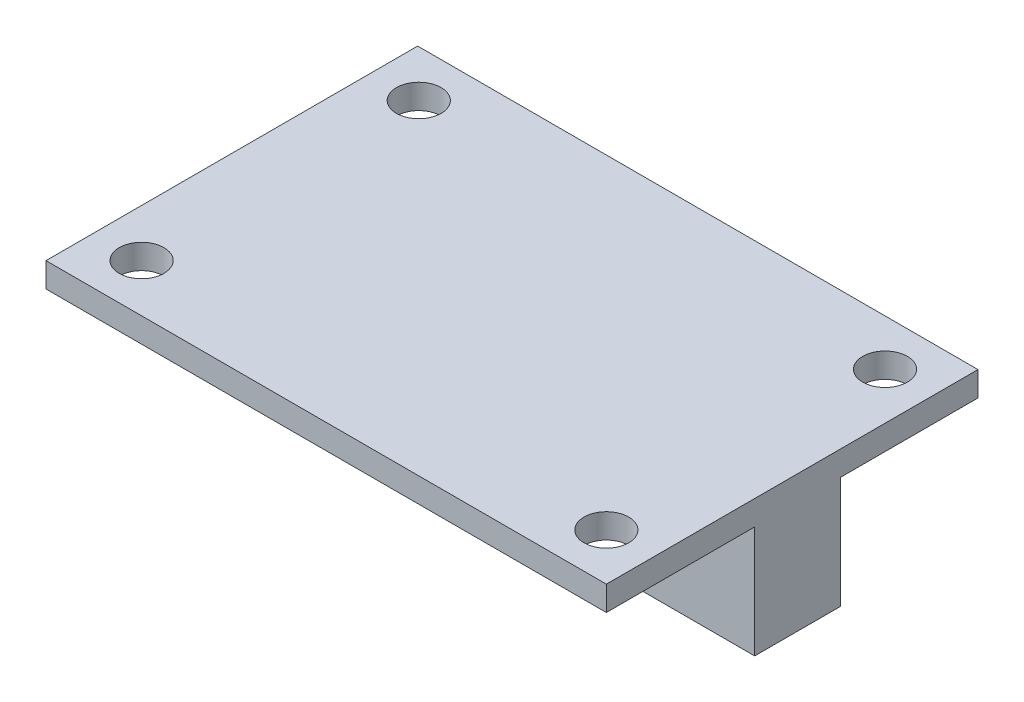
ISO-10303-21;
HEADER;
FILE_DESCRIPTION(('STEP AP214'),'2;1');
FILE_NAME('part.step','',(''),(''),'','','');
FILE_SCHEMA(('AUTOMOTIVE_DESIGN { 1 0 10303 214 1 1 1 1 }'));
ENDSEC;
DATA;
#1=APPLICATION_CONTEXT('core data for automotive mechanical design processes');
#2=APPLICATION_PROTOCOL_DEFINITION('international standard','automotive_design',2000,#1);
#3=PRODUCT_CONTEXT('',#1,'mechanical');
#4=PRODUCT('Part','Part','',(#3));
#5=PRODUCT_RELATED_PRODUCT_CATEGORY('part','',(#4));
#6=PRODUCT_DEFINITION_FORMATION('','',#4);
#7=PRODUCT_DEFINITION_CONTEXT('part definition',#1,'design');
#8=PRODUCT_DEFINITION('design','',#6,#7);
#9=PRODUCT_DEFINITION_SHAPE('','',#8);
#10=(LENGTH_UNIT() NAMED_UNIT(*) SI_UNIT(.MILLI.,.METRE.));
#11=(NAMED_UNIT(*) PLANE_ANGLE_UNIT() SI_UNIT($,.RADIAN.));
#12=(NAMED_UNIT(*) SI_UNIT($,.STERADIAN.) SOLID_ANGLE_UNIT());
#13=UNCERTAINTY_MEASURE_WITH_UNIT(LENGTH_MEASURE(1.E-05),#10,'distance_accuracy_value','');
#14=(GEOMETRIC_REPRESENTATION_CONTEXT(3) GLOBAL_UNCERTAINTY_ASSIGNED_CONTEXT((#13)) GLOBAL_UNIT_ASSIGNED_CONTEXT((#10,
#11,#12)) REPRESENTATION_CONTEXT('',''));
#15=CARTESIAN_POINT('',(0.,0.,0.));
#16=DIRECTION('',(0.,0.,1.));
#17=DIRECTION('',(1.,0.,0.));
#18=AXIS2_PLACEMENT_3D('',#15,#16,#17);
#19=CARTESIAN_POINT('',(0.,0.,0.));
#20=DIRECTION('',(0.,1.,0.));
#21=DIRECTION('',(0.,0.,1.));
#22=AXIS2_PLACEMENT_3D('',#19,#20,#21);
#23=PLANE('',#22);
#24=CARTESIAN_POINT('',(-15.8492761470884,0.,-9.49368315878314));
#25=DIRECTION('',(0.,1.,0.));
#26=DIRECTION('',(0.,0.,1.));
#27=AXIS2_PLACEMENT_3D('',#24,#25,#26);
#28=CIRCLE('',#27,1.524);
#29=CARTESIAN_POINT('',(-15.8492761470884,0.,-7.96968315878314));
#30=VERTEX_POINT('',#29);
#31=EDGE_CURVE('E146',#30,#30,#28,.T.);
#32=ORIENTED_EDGE('',*,*,#31,.T.);
#33=EDGE_LOOP('',(#32));
#34=FACE_BOUND('',#33,.T.);
#35=CARTESIAN_POINT('',(-15.8492761470884,0.,9.40478315878314));
#36=DIRECTION('',(0.,1.,0.));
#37=DIRECTION('',(0.,0.,1.));
#38=AXIS2_PLACEMENT_3D('',#35,#36,#37);
#39=CIRCLE('',#38,1.524);
#40=CARTESIAN_POINT('',(-15.8492761470884,0.,10.9287831587831));
#41=VERTEX_POINT('',#40);
#42=EDGE_CURVE('E135',#41,#41,#39,.T.);
#43=ORIENTED_EDGE('',*,*,#42,.T.);
#44=EDGE_LOOP('',(#43));
#45=FACE_BOUND('',#44,.T.);
#46=CARTESIAN_POINT('',(15.9000761470884,0.,9.46828315878314));
#47=DIRECTION('',(0.,1.,0.));
#48=DIRECTION('',(0.,0.,1.));
#49=AXIS2_PLACEMENT_3D('',#46,#47,#48);
#50=CIRCLE('',#49,1.524);
#51=CARTESIAN_POINT('',(15.9000761470884,0.,10.9922831587831));
#52=VERTEX_POINT('',#51);
#53=EDGE_CURVE('E141',#52,#52,#50,.T.);
#54=ORIENTED_EDGE('',*,*,#53,.T.);
#55=EDGE_LOOP('',(#54));
#56=FACE_BOUND('',#55,.T.);
#57=CARTESIAN_POINT('',(15.9127761470884,0.,-9.51908315878314));
#58=DIRECTION('',(0.,1.,0.));
#59=DIRECTION('',(0.,0.,1.));
#60=AXIS2_PLACEMENT_3D('',#57,#58,#59);
#61=CIRCLE('',#60,1.524);
#62=CARTESIAN_POINT('',(15.9127761470884,0.,-7.99508315878314));
#63=VERTEX_POINT('',#62);
#64=EDGE_CURVE('E122',#63,#63,#61,.T.);
#65=ORIENTED_EDGE('',*,*,#64,.T.);
#66=EDGE_LOOP('',(#65));
#67=FACE_BOUND('',#66,.T.);
#68=DIRECTION('',(1.,0.,0.));
#69=VECTOR('',#68,1.);
#70=CARTESIAN_POINT('',(19.1004761470884,0.,-3.28611234979803));
#71=LINE('',#70,#69);
#72=CARTESIAN_POINT('',(11.3391371140317,0.,-3.28611234979803));
#73=VERTEX_POINT('',#72);
#74=CARTESIAN_POINT('',(19.1004761470884,0.,-3.28611234979803));
#75=VERTEX_POINT('',#74);
#76=EDGE_CURVE('E49',#73,#75,#71,.T.);
#77=ORIENTED_EDGE('',*,*,#76,.F.);
#78=DIRECTION('',(0.,0.,-1.));
#79=VECTOR('',#78,1.);
#80=CARTESIAN_POINT('',(11.3391371140317,0.,2.55588765020196));
#81=LINE('',#80,#79);
#82=CARTESIAN_POINT('',(11.3391371140317,0.,2.55588765020196));
#83=VERTEX_POINT('',#82);
#84=EDGE_CURVE('E331',#83,#73,#81,.T.);
#85=ORIENTED_EDGE('',*,*,#84,.F.);
#86=DIRECTION('',(-1.,0.,0.));
#87=VECTOR('',#86,1.);
#88=CARTESIAN_POINT('',(19.1004761470884,0.,2.55588765020196));
#89=LINE('',#88,#87);
#90=CARTESIAN_POINT('',(19.1004761470884,0.,2.55588765020196));
#91=VERTEX_POINT('',#90);
#92=EDGE_CURVE('E333',#91,#83,#89,.T.);
#93=ORIENTED_EDGE('',*,*,#92,.F.);
#94=DIRECTION('',(0.,0.,-1.));
#95=VECTOR('',#94,1.);
#96=CARTESIAN_POINT('',(19.1004761470884,0.,-12.6686831587831));
#97=LINE('',#96,#95);
#98=CARTESIAN_POINT('',(19.1004761470884,0.,12.6686831587831));
#99=VERTEX_POINT('',#98);
#100=EDGE_CURVE('E121',#99,#91,#97,.T.);
#101=ORIENTED_EDGE('',*,*,#100,.F.);
#102=DIRECTION('',(1.,0.,0.));
#103=VECTOR('',#102,1.);
#104=CARTESIAN_POINT('',(-19.1004761470884,0.,12.6686831587831));
#105=LINE('',#104,#103);
#106=CARTESIAN_POINT('',(-19.1004761470884,0.,12.6686831587831));
#107=VERTEX_POINT('',#106);
#108=EDGE_CURVE('E155',#107,#99,#105,.T.);
#109=ORIENTED_EDGE('',*,*,#108,.F.);
#110=DIRECTION('',(0.,0.,1.));
#111=VECTOR('',#110,1.);
#112=CARTESIAN_POINT('',(-19.1004761470884,0.,-12.6686831587831));
#113=LINE('',#112,#111);
#114=CARTESIAN_POINT('',(-19.1004761470884,0.,-12.6686831587831));
#115=VERTEX_POINT('',#114);
#116=EDGE_CURVE('E165',#115,#107,#113,.T.);
#117=ORIENTED_EDGE('',*,*,#116,.F.);
#118=DIRECTION('',(-1.,0.,0.));
#119=VECTOR('',#118,1.);
#120=CARTESIAN_POINT('',(-19.1004761470884,0.,-12.6686831587831));
#121=LINE('',#120,#119);
#122=CARTESIAN_POINT('',(19.1004761470884,0.,-12.6686831587831));
#123=VERTEX_POINT('',#122);
#124=EDGE_CURVE('E163',#123,#115,#121,.T.);
#125=ORIENTED_EDGE('',*,*,#124,.F.);
#126=EDGE_CURVE('E54',#75,#123,#97,.T.);
#127=ORIENTED_EDGE('',*,*,#126,.F.);
#128=EDGE_LOOP('',(#77,#85,#93,#101,#109,#117,#125,#127));
#129=FACE_BOUND('',#128,.T.);
#130=ADVANCED_FACE('F34',(#34,#45,#56,#67,#129),#23,.F.);
#131=CARTESIAN_POINT('',(19.1004761470884,1.6764,-12.6686831587831));
#132=DIRECTION('',(-1.,0.,0.));
#133=DIRECTION('',(0.,0.,1.));
#134=AXIS2_PLACEMENT_3D('',#131,#132,#133);
#135=PLANE('',#134);
#136=ORIENTED_EDGE('',*,*,#100,.T.);
#137=DIRECTION('',(0.,1.,0.));
#138=VECTOR('',#137,1.);
#139=CARTESIAN_POINT('',(19.1004761470884,-7.62,2.55588765020196));
#140=LINE('',#139,#138);
#141=CARTESIAN_POINT('',(19.1004761470884,-7.62,2.55588765020196));
#142=VERTEX_POINT('',#141);
#143=EDGE_CURVE('E102',#142,#91,#140,.T.);
#144=ORIENTED_EDGE('',*,*,#143,.F.);
#145=DIRECTION('',(0.,0.,1.));
#146=VECTOR('',#145,1.);
#147=CARTESIAN_POINT('',(19.1004761470884,-7.62,2.55588765020196));
#148=LINE('',#147,#146);
#149=CARTESIAN_POINT('',(19.1004761470884,-7.62,-3.28611234979803));
#150=VERTEX_POINT('',#149);
#151=EDGE_CURVE('E108',#150,#142,#148,.T.);
#152=ORIENTED_EDGE('',*,*,#151,.F.);
#153=DIRECTION('',(0.,1.,0.));
#154=VECTOR('',#153,1.);
#155=CARTESIAN_POINT('',(19.1004761470884,-7.62,-3.28611234979803));
#156=LINE('',#155,#154);
#157=EDGE_CURVE('E335',#150,#75,#156,.T.);
#158=ORIENTED_EDGE('',*,*,#157,.T.);
#159=ORIENTED_EDGE('',*,*,#126,.T.);
#160=DIRECTION('',(0.,-1.,0.));
#161=VECTOR('',#160,1.);
#162=CARTESIAN_POINT('',(19.1004761470884,1.6764,-12.6686831587831));
#163=LINE('',#162,#161);
#164=CARTESIAN_POINT('',(19.1004761470884,1.6764,-12.6686831587831));
#165=VERTEX_POINT('',#164);
#166=EDGE_CURVE('E11',#165,#123,#163,.T.);
#167=ORIENTED_EDGE('',*,*,#166,.F.);
#168=DIRECTION('',(0.,0.,-1.));
#169=VECTOR('',#168,1.);
#170=CARTESIAN_POINT('',(19.1004761470884,1.6764,-12.6686831587831));
#171=LINE('',#170,#169);
#172=CARTESIAN_POINT('',(19.1004761470884,1.6764,12.6686831587831));
#173=VERTEX_POINT('',#172);
#174=EDGE_CURVE('E151',#173,#165,#171,.T.);
#175=ORIENTED_EDGE('',*,*,#174,.F.);
#176=DIRECTION('',(0.,-1.,0.));
#177=VECTOR('',#176,1.);
#178=CARTESIAN_POINT('',(19.1004761470884,1.6764,12.6686831587831));
#179=LINE('',#178,#177);
#180=EDGE_CURVE('E161',#173,#99,#179,.T.);
#181=ORIENTED_EDGE('',*,*,#180,.T.);
#182=EDGE_LOOP('',(#136,#144,#152,#158,#159,#167,#175,#181));
#183=FACE_BOUND('',#182,.T.);
#184=ADVANCED_FACE('F36',(#183),#135,.F.);
#185=CARTESIAN_POINT('',(-19.1004761470884,1.6764,-12.6686831587831));
#186=DIRECTION('',(0.,0.,1.));
#187=DIRECTION('',(1.,0.,0.));
#188=AXIS2_PLACEMENT_3D('',#185,#186,#187);
#189=PLANE('',#188);
#190=ORIENTED_EDGE('',*,*,#124,.T.);
#191=DIRECTION('',(0.,-1.,0.));
#192=VECTOR('',#191,1.);
#193=CARTESIAN_POINT('',(-19.1004761470884,1.6764,-12.6686831587831));
#194=LINE('',#193,#192);
#195=CARTESIAN_POINT('',(-19.1004761470884,1.6764,-12.6686831587831));
#196=VERTEX_POINT('',#195);
#197=EDGE_CURVE('E42',#196,#115,#194,.T.);
#198=ORIENTED_EDGE('',*,*,#197,.F.);
#199=DIRECTION('',(-1.,0.,0.));
#200=VECTOR('',#199,1.);
#201=CARTESIAN_POINT('',(-19.1004761470884,1.6764,-12.6686831587831));
#202=LINE('',#201,#200);
#203=EDGE_CURVE('E154',#165,#196,#202,.T.);
#204=ORIENTED_EDGE('',*,*,#203,.F.);
#205=ORIENTED_EDGE('',*,*,#166,.T.);
#206=EDGE_LOOP('',(#190,#198,#204,#205));
#207=FACE_BOUND('',#206,.T.);
#208=ADVANCED_FACE('F188',(#207),#189,.F.);
#209=CARTESIAN_POINT('',(-19.1004761470884,1.6764,-12.6686831587831));
#210=DIRECTION('',(1.,0.,0.));
#211=DIRECTION('',(0.,0.,-1.));
#212=AXIS2_PLACEMENT_3D('',#209,#210,#211);
#213=PLANE('',#212);
#214=ORIENTED_EDGE('',*,*,#116,.T.);
#215=DIRECTION('',(0.,-1.,0.));
#216=VECTOR('',#215,1.);
#217=CARTESIAN_POINT('',(-19.1004761470884,1.6764,12.6686831587831));
#218=LINE('',#217,#216);
#219=CARTESIAN_POINT('',(-19.1004761470884,1.6764,12.6686831587831));
#220=VERTEX_POINT('',#219);
#221=EDGE_CURVE('E169',#220,#107,#218,.T.);
#222=ORIENTED_EDGE('',*,*,#221,.F.);
#223=DIRECTION('',(0.,0.,1.));
#224=VECTOR('',#223,1.);
#225=CARTESIAN_POINT('',(-19.1004761470884,1.6764,-12.6686831587831));
#226=LINE('',#225,#224);
#227=EDGE_CURVE('E157',#196,#220,#226,.T.);
#228=ORIENTED_EDGE('',*,*,#227,.F.);
#229=ORIENTED_EDGE('',*,*,#197,.T.);
#230=EDGE_LOOP('',(#214,#222,#228,#229));
#231=FACE_BOUND('',#230,.T.);
#232=ADVANCED_FACE('F176',(#231),#213,.F.);
#233=CARTESIAN_POINT('',(-19.1004761470884,1.6764,12.6686831587831));
#234=DIRECTION('',(0.,0.,-1.));
#235=DIRECTION('',(-1.,0.,0.));
#236=AXIS2_PLACEMENT_3D('',#233,#234,#235);
#237=PLANE('',#236);
#238=ORIENTED_EDGE('',*,*,#108,.T.);
#239=ORIENTED_EDGE('',*,*,#180,.F.);
#240=DIRECTION('',(1.,0.,0.));
#241=VECTOR('',#240,1.);
#242=CARTESIAN_POINT('',(-19.1004761470884,1.6764,12.6686831587831));
#243=LINE('',#242,#241);
#244=EDGE_CURVE('E159',#220,#173,#243,.T.);
#245=ORIENTED_EDGE('',*,*,#244,.F.);
#246=ORIENTED_EDGE('',*,*,#221,.T.);
#247=EDGE_LOOP('',(#238,#239,#245,#246));
#248=FACE_BOUND('',#247,.T.);
#249=ADVANCED_FACE('F182',(#248),#237,.F.);
#250=CARTESIAN_POINT('',(0.,1.6764,0.));
#251=DIRECTION('',(0.,1.,0.));
#252=DIRECTION('',(0.,0.,1.));
#253=AXIS2_PLACEMENT_3D('',#250,#251,#252);
#254=PLANE('',#253);
#255=CARTESIAN_POINT('',(15.9127761470884,1.6764,-9.51908315878314));
#256=DIRECTION('',(0.,1.,0.));
#257=DIRECTION('',(0.,0.,1.));
#258=AXIS2_PLACEMENT_3D('',#255,#256,#257);
#259=CIRCLE('',#258,1.524);
#260=CARTESIAN_POINT('',(15.9127761470884,1.6764,-7.99508315878314));
#261=VERTEX_POINT('',#260);
#262=EDGE_CURVE('E125',#261,#261,#259,.T.);
#263=ORIENTED_EDGE('',*,*,#262,.F.);
#264=EDGE_LOOP('',(#263));
#265=FACE_BOUND('',#264,.T.);
#266=CARTESIAN_POINT('',(15.9000761470884,1.6764,9.46828315878314));
#267=DIRECTION('',(0.,1.,0.));
#268=DIRECTION('',(0.,0.,1.));
#269=AXIS2_PLACEMENT_3D('',#266,#267,#268);
#270=CIRCLE('',#269,1.524);
#271=CARTESIAN_POINT('',(15.9000761470884,1.6764,10.9922831587831));
#272=VERTEX_POINT('',#271);
#273=EDGE_CURVE('E138',#272,#272,#270,.T.);
#274=ORIENTED_EDGE('',*,*,#273,.F.);
#275=EDGE_LOOP('',(#274));
#276=FACE_BOUND('',#275,.T.);
#277=CARTESIAN_POINT('',(-15.8492761470884,1.6764,9.40478315878314));
#278=DIRECTION('',(0.,1.,0.));
#279=DIRECTION('',(0.,0.,1.));
#280=AXIS2_PLACEMENT_3D('',#277,#278,#279);
#281=CIRCLE('',#280,1.524);
#282=CARTESIAN_POINT('',(-15.8492761470884,1.6764,10.9287831587831));
#283=VERTEX_POINT('',#282);
#284=EDGE_CURVE('E131',#283,#283,#281,.T.);
#285=ORIENTED_EDGE('',*,*,#284,.F.);
#286=EDGE_LOOP('',(#285));
#287=FACE_BOUND('',#286,.T.);
#288=CARTESIAN_POINT('',(-15.8492761470884,1.6764,-9.49368315878314));
#289=DIRECTION('',(0.,1.,0.));
#290=DIRECTION('',(0.,0.,1.));
#291=AXIS2_PLACEMENT_3D('',#288,#289,#290);
#292=CIRCLE('',#291,1.524);
#293=CARTESIAN_POINT('',(-15.8492761470884,1.6764,-7.96968315878314));
#294=VERTEX_POINT('',#293);
#295=EDGE_CURVE('E134',#294,#294,#292,.T.);
#296=ORIENTED_EDGE('',*,*,#295,.F.);
#297=EDGE_LOOP('',(#296));
#298=FACE_BOUND('',#297,.T.);
#299=ORIENTED_EDGE('',*,*,#174,.T.);
#300=ORIENTED_EDGE('',*,*,#203,.T.);
#301=ORIENTED_EDGE('',*,*,#227,.T.);
#302=ORIENTED_EDGE('',*,*,#244,.T.);
#303=EDGE_LOOP('',(#299,#300,#301,#302));
#304=FACE_BOUND('',#303,.T.);
#305=ADVANCED_FACE('F187',(#265,#276,#287,#298,#304),#254,.T.);
#306=CARTESIAN_POINT('',(-15.8492761470884,0.,-9.49368315878314));
#307=DIRECTION('',(0.,1.,0.));
#308=DIRECTION('',(0.,0.,1.));
#309=AXIS2_PLACEMENT_3D('',#306,#307,#308);
#310=CYLINDRICAL_SURFACE('',#309,1.524);
#311=ORIENTED_EDGE('',*,*,#31,.F.);
#312=EDGE_LOOP('',(#311));
#313=FACE_BOUND('',#312,.T.);
#314=ORIENTED_EDGE('',*,*,#295,.T.);
#315=EDGE_LOOP('',(#314));
#316=FACE_BOUND('',#315,.T.);
#317=ADVANCED_FACE('F208',(#313,#316),#310,.F.);
#318=CARTESIAN_POINT('',(-15.8492761470884,0.,9.40478315878314));
#319=DIRECTION('',(0.,1.,0.));
#320=DIRECTION('',(0.,0.,1.));
#321=AXIS2_PLACEMENT_3D('',#318,#319,#320);
#322=CYLINDRICAL_SURFACE('',#321,1.524);
#323=ORIENTED_EDGE('',*,*,#42,.F.);
#324=EDGE_LOOP('',(#323));
#325=FACE_BOUND('',#324,.T.);
#326=ORIENTED_EDGE('',*,*,#284,.T.);
#327=EDGE_LOOP('',(#326));
#328=FACE_BOUND('',#327,.T.);
#329=ADVANCED_FACE('F213',(#325,#328),#322,.F.);
#330=CARTESIAN_POINT('',(15.9000761470884,0.,9.46828315878314));
#331=DIRECTION('',(0.,1.,0.));
#332=DIRECTION('',(0.,0.,1.));
#333=AXIS2_PLACEMENT_3D('',#330,#331,#332);
#334=CYLINDRICAL_SURFACE('',#333,1.524);
#335=ORIENTED_EDGE('',*,*,#53,.F.);
#336=EDGE_LOOP('',(#335));
#337=FACE_BOUND('',#336,.T.);
#338=ORIENTED_EDGE('',*,*,#273,.T.);
#339=EDGE_LOOP('',(#338));
#340=FACE_BOUND('',#339,.T.);
#341=ADVANCED_FACE('F225',(#337,#340),#334,.F.);
#342=CARTESIAN_POINT('',(15.9127761470884,0.,-9.51908315878314));
#343=DIRECTION('',(0.,1.,0.));
#344=DIRECTION('',(0.,0.,1.));
#345=AXIS2_PLACEMENT_3D('',#342,#343,#344);
#346=CYLINDRICAL_SURFACE('',#345,1.524);
#347=ORIENTED_EDGE('',*,*,#64,.F.);
#348=EDGE_LOOP('',(#347));
#349=FACE_BOUND('',#348,.T.);
#350=ORIENTED_EDGE('',*,*,#262,.T.);
#351=EDGE_LOOP('',(#350));
#352=FACE_BOUND('',#351,.T.);
#353=ADVANCED_FACE('F231',(#349,#352),#346,.F.);
#354=CARTESIAN_POINT('',(19.1004761470884,-7.62,2.55588765020196));
#355=DIRECTION('',(0.,0.,-1.));
#356=DIRECTION('',(-1.,0.,0.));
#357=AXIS2_PLACEMENT_3D('',#354,#355,#356);
#358=PLANE('',#357);
#359=ORIENTED_EDGE('',*,*,#92,.T.);
#360=DIRECTION('',(0.,1.,0.));
#361=VECTOR('',#360,1.);
#362=CARTESIAN_POINT('',(11.3391371140317,-7.62,2.55588765020196));
#363=LINE('',#362,#361);
#364=CARTESIAN_POINT('',(11.3391371140317,-7.62,2.55588765020196));
#365=VERTEX_POINT('',#364);
#366=EDGE_CURVE('E104',#365,#83,#363,.T.);
#367=ORIENTED_EDGE('',*,*,#366,.F.);
#368=DIRECTION('',(-1.,0.,0.));
#369=VECTOR('',#368,1.);
#370=CARTESIAN_POINT('',(19.1004761470884,-7.62,2.55588765020196));
#371=LINE('',#370,#369);
#372=EDGE_CURVE('E97',#142,#365,#371,.T.);
#373=ORIENTED_EDGE('',*,*,#372,.F.);
#374=ORIENTED_EDGE('',*,*,#143,.T.);
#375=EDGE_LOOP('',(#359,#367,#373,#374));
#376=FACE_BOUND('',#375,.T.);
#377=ADVANCED_FACE('F100',(#376),#358,.F.);
#378=CARTESIAN_POINT('',(11.3391371140317,-7.62,2.55588765020196));
#379=DIRECTION('',(1.,0.,0.));
#380=DIRECTION('',(0.,0.,-1.));
#381=AXIS2_PLACEMENT_3D('',#378,#379,#380);
#382=PLANE('',#381);
#383=ORIENTED_EDGE('',*,*,#84,.T.);
#384=DIRECTION('',(0.,1.,0.));
#385=VECTOR('',#384,1.);
#386=CARTESIAN_POINT('',(11.3391371140317,-7.62,-3.28611234979803));
#387=LINE('',#386,#385);
#388=CARTESIAN_POINT('',(11.3391371140317,-7.62,-3.28611234979803));
#389=VERTEX_POINT('',#388);
#390=EDGE_CURVE('E127',#389,#73,#387,.T.);
#391=ORIENTED_EDGE('',*,*,#390,.F.);
#392=DIRECTION('',(0.,0.,-1.));
#393=VECTOR('',#392,1.);
#394=CARTESIAN_POINT('',(11.3391371140317,-7.62,2.55588765020196));
#395=LINE('',#394,#393);
#396=EDGE_CURVE('E107',#365,#389,#395,.T.);
#397=ORIENTED_EDGE('',*,*,#396,.F.);
#398=ORIENTED_EDGE('',*,*,#366,.T.);
#399=EDGE_LOOP('',(#383,#391,#397,#398));
#400=FACE_BOUND('',#399,.T.);
#401=ADVANCED_FACE('F243',(#400),#382,.F.);
#402=CARTESIAN_POINT('',(19.1004761470884,-7.62,-3.28611234979803));
#403=DIRECTION('',(0.,0.,1.));
#404=DIRECTION('',(1.,0.,0.));
#405=AXIS2_PLACEMENT_3D('',#402,#403,#404);
#406=PLANE('',#405);
#407=ORIENTED_EDGE('',*,*,#76,.T.);
#408=ORIENTED_EDGE('',*,*,#157,.F.);
#409=DIRECTION('',(1.,0.,0.));
#410=VECTOR('',#409,1.);
#411=CARTESIAN_POINT('',(19.1004761470884,-7.62,-3.28611234979803));
#412=LINE('',#411,#410);
#413=EDGE_CURVE('E113',#389,#150,#412,.T.);
#414=ORIENTED_EDGE('',*,*,#413,.F.);
#415=ORIENTED_EDGE('',*,*,#390,.T.);
#416=EDGE_LOOP('',(#407,#408,#414,#415));
#417=FACE_BOUND('',#416,.T.);
#418=ADVANCED_FACE('F250',(#417),#406,.F.);
#419=CARTESIAN_POINT('',(0.,-7.62,0.));
#420=DIRECTION('',(0.,1.,0.));
#421=DIRECTION('',(0.,0.,1.));
#422=AXIS2_PLACEMENT_3D('',#419,#420,#421);
#423=PLANE('',#422);
#424=ORIENTED_EDGE('',*,*,#151,.T.);
#425=ORIENTED_EDGE('',*,*,#372,.T.);
#426=ORIENTED_EDGE('',*,*,#396,.T.);
#427=ORIENTED_EDGE('',*,*,#413,.T.);
#428=EDGE_LOOP('',(#424,#425,#426,#427));
#429=FACE_BOUND('',#428,.T.);
#430=ADVANCED_FACE('F111',(#429),#423,.F.);
#431=CLOSED_SHELL('',(#130,#184,#208,#232,#249,#305,#317,#329,#341,#353,#377,#401,#418,#430));
#432=MANIFOLD_SOLID_BREP('B2',#431);
#433=ADVANCED_BREP_SHAPE_REPRESENTATION('',(#18,#432),#14);
#434=SHAPE_DEFINITION_REPRESENTATION(#9,#433);
ENDSEC;
END-ISO-10303-21;
